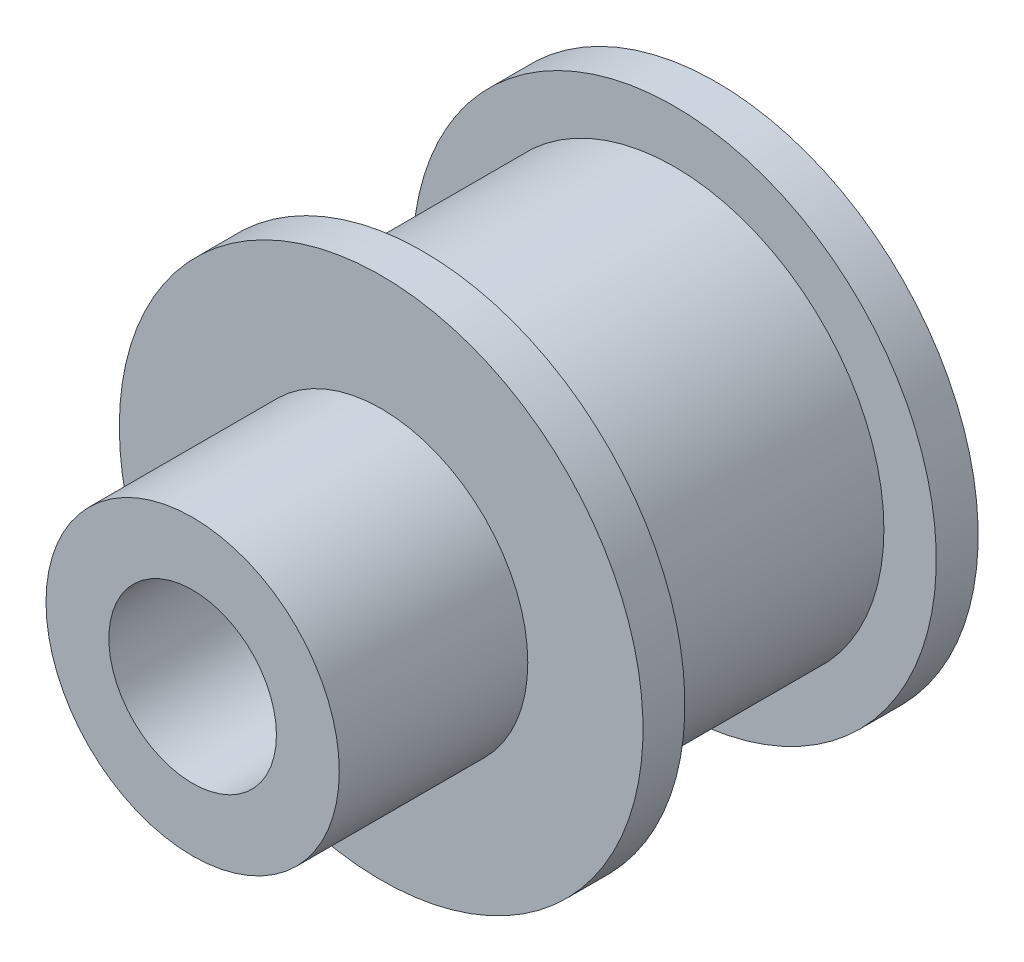
ISO-10303-21;
HEADER;
FILE_DESCRIPTION(('STEP AP214'),'2;1');
FILE_NAME('part.step','',(''),(''),'','','');
FILE_SCHEMA(('AUTOMOTIVE_DESIGN { 1 0 10303 214 1 1 1 1 }'));
ENDSEC;
DATA;
#1=APPLICATION_CONTEXT('core data for automotive mechanical design processes');
#2=APPLICATION_PROTOCOL_DEFINITION('international standard','automotive_design',2000,#1);
#3=PRODUCT_CONTEXT('',#1,'mechanical');
#4=PRODUCT('Part','Part','',(#3));
#5=PRODUCT_RELATED_PRODUCT_CATEGORY('part','',(#4));
#6=PRODUCT_DEFINITION_FORMATION('','',#4);
#7=PRODUCT_DEFINITION_CONTEXT('part definition',#1,'design');
#8=PRODUCT_DEFINITION('design','',#6,#7);
#9=PRODUCT_DEFINITION_SHAPE('','',#8);
#10=(LENGTH_UNIT() NAMED_UNIT(*) SI_UNIT(.MILLI.,.METRE.));
#11=(NAMED_UNIT(*) PLANE_ANGLE_UNIT() SI_UNIT($,.RADIAN.));
#12=(NAMED_UNIT(*) SI_UNIT($,.STERADIAN.) SOLID_ANGLE_UNIT());
#13=UNCERTAINTY_MEASURE_WITH_UNIT(LENGTH_MEASURE(1.E-05),#10,'distance_accuracy_value','');
#14=(GEOMETRIC_REPRESENTATION_CONTEXT(3) GLOBAL_UNCERTAINTY_ASSIGNED_CONTEXT((#13)) GLOBAL_UNIT_ASSIGNED_CONTEXT((#10,
#11,#12)) REPRESENTATION_CONTEXT('',''));
#15=CARTESIAN_POINT('',(0.,0.,0.));
#16=DIRECTION('',(0.,0.,1.));
#17=DIRECTION('',(1.,0.,0.));
#18=AXIS2_PLACEMENT_3D('',#15,#16,#17);
#19=CARTESIAN_POINT('',(0.,0.,-2.));
#20=DIRECTION('',(0.,0.,-1.));
#21=DIRECTION('',(-1.,0.,0.));
#22=AXIS2_PLACEMENT_3D('',#19,#20,#21);
#23=PLANE('',#22);
#24=CARTESIAN_POINT('',(0.,0.,-2.));
#25=DIRECTION('',(0.,0.,-1.));
#26=DIRECTION('',(-1.,0.,0.));
#27=AXIS2_PLACEMENT_3D('',#24,#25,#26);
#28=CIRCLE('',#27,12.5);
#29=CARTESIAN_POINT('',(-12.5,0.,-2.));
#30=VERTEX_POINT('',#29);
#31=EDGE_CURVE('E43',#30,#30,#28,.T.);
#32=ORIENTED_EDGE('',*,*,#31,.T.);
#33=EDGE_LOOP('',(#32));
#34=FACE_BOUND('',#33,.T.);
#35=CARTESIAN_POINT('',(0.,0.,-2.));
#36=DIRECTION('',(0.,0.,-1.));
#37=DIRECTION('',(-1.,0.,0.));
#38=AXIS2_PLACEMENT_3D('',#35,#36,#37);
#39=CIRCLE('',#38,10.);
#40=CARTESIAN_POINT('',(-10.,0.,-2.));
#41=VERTEX_POINT('',#40);
#42=EDGE_CURVE('E54',#41,#41,#39,.T.);
#43=ORIENTED_EDGE('',*,*,#42,.F.);
#44=EDGE_LOOP('',(#43));
#45=FACE_BOUND('',#44,.T.);
#46=ADVANCED_FACE('F28',(#34,#45),#23,.T.);
#47=CARTESIAN_POINT('',(0.,0.,9.));
#48=DIRECTION('',(0.,0.,1.));
#49=DIRECTION('',(1.,0.,0.));
#50=AXIS2_PLACEMENT_3D('',#47,#48,#49);
#51=PLANE('',#50);
#52=CARTESIAN_POINT('',(0.,0.,9.));
#53=DIRECTION('',(0.,0.,1.));
#54=DIRECTION('',(1.,0.,0.));
#55=AXIS2_PLACEMENT_3D('',#52,#53,#54);
#56=CIRCLE('',#55,7.);
#57=CARTESIAN_POINT('',(7.,0.,9.));
#58=VERTEX_POINT('',#57);
#59=EDGE_CURVE('E10',#58,#58,#56,.T.);
#60=ORIENTED_EDGE('',*,*,#59,.T.);
#61=EDGE_LOOP('',(#60));
#62=FACE_BOUND('',#61,.T.);
#63=CARTESIAN_POINT('',(0.,0.,9.));
#64=DIRECTION('',(0.,0.,1.));
#65=DIRECTION('',(1.,0.,0.));
#66=AXIS2_PLACEMENT_3D('',#63,#64,#65);
#67=CIRCLE('',#66,4.);
#68=CARTESIAN_POINT('',(4.,0.,9.));
#69=VERTEX_POINT('',#68);
#70=EDGE_CURVE('E35',#69,#69,#67,.T.);
#71=ORIENTED_EDGE('',*,*,#70,.F.);
#72=EDGE_LOOP('',(#71));
#73=FACE_BOUND('',#72,.T.);
#74=ADVANCED_FACE('F81',(#62,#73),#51,.T.);
#75=CARTESIAN_POINT('',(0.,0.,9.));
#76=DIRECTION('',(0.,0.,-1.));
#77=DIRECTION('',(-1.,0.,0.));
#78=AXIS2_PLACEMENT_3D('',#75,#76,#77);
#79=CYLINDRICAL_SURFACE('',#78,7.);
#80=ORIENTED_EDGE('',*,*,#59,.F.);
#81=EDGE_LOOP('',(#80));
#82=FACE_BOUND('',#81,.T.);
#83=CARTESIAN_POINT('',(0.,0.,0.));
#84=DIRECTION('',(0.,0.,-1.));
#85=DIRECTION('',(-1.,0.,0.));
#86=AXIS2_PLACEMENT_3D('',#83,#84,#85);
#87=CIRCLE('',#86,7.);
#88=CARTESIAN_POINT('',(-7.,0.,0.));
#89=VERTEX_POINT('',#88);
#90=EDGE_CURVE('E39',#89,#89,#87,.T.);
#91=ORIENTED_EDGE('',*,*,#90,.F.);
#92=EDGE_LOOP('',(#91));
#93=FACE_BOUND('',#92,.T.);
#94=ADVANCED_FACE('F30',(#82,#93),#79,.T.);
#95=CARTESIAN_POINT('',(0.,0.,9.));
#96=DIRECTION('',(0.,0.,-1.));
#97=DIRECTION('',(-1.,0.,0.));
#98=AXIS2_PLACEMENT_3D('',#95,#96,#97);
#99=CYLINDRICAL_SURFACE('',#98,4.);
#100=ORIENTED_EDGE('',*,*,#70,.T.);
#101=EDGE_LOOP('',(#100));
#102=FACE_BOUND('',#101,.T.);
#103=CARTESIAN_POINT('',(0.,0.,-16.));
#104=DIRECTION('',(0.,0.,1.));
#105=DIRECTION('',(1.,0.,0.));
#106=AXIS2_PLACEMENT_3D('',#103,#104,#105);
#107=CIRCLE('',#106,4.);
#108=CARTESIAN_POINT('',(4.,0.,-16.));
#109=VERTEX_POINT('',#108);
#110=EDGE_CURVE('E63',#109,#109,#107,.T.);
#111=ORIENTED_EDGE('',*,*,#110,.F.);
#112=EDGE_LOOP('',(#111));
#113=FACE_BOUND('',#112,.T.);
#114=ADVANCED_FACE('F70',(#102,#113),#99,.F.);
#115=CARTESIAN_POINT('',(0.,0.,0.));
#116=DIRECTION('',(0.,0.,-1.));
#117=DIRECTION('',(-1.,0.,0.));
#118=AXIS2_PLACEMENT_3D('',#115,#116,#117);
#119=PLANE('',#118);
#120=CARTESIAN_POINT('',(0.,0.,0.));
#121=DIRECTION('',(0.,0.,-1.));
#122=DIRECTION('',(-1.,0.,0.));
#123=AXIS2_PLACEMENT_3D('',#120,#121,#122);
#124=CIRCLE('',#123,12.5);
#125=CARTESIAN_POINT('',(-12.5,0.,0.));
#126=VERTEX_POINT('',#125);
#127=EDGE_CURVE('E48',#126,#126,#124,.T.);
#128=ORIENTED_EDGE('',*,*,#127,.F.);
#129=EDGE_LOOP('',(#128));
#130=FACE_BOUND('',#129,.T.);
#131=ORIENTED_EDGE('',*,*,#90,.T.);
#132=EDGE_LOOP('',(#131));
#133=FACE_BOUND('',#132,.T.);
#134=ADVANCED_FACE('F72',(#130,#133),#119,.F.);
#135=CARTESIAN_POINT('',(0.,0.,-2.));
#136=DIRECTION('',(0.,0.,1.));
#137=DIRECTION('',(1.,0.,0.));
#138=AXIS2_PLACEMENT_3D('',#135,#136,#137);
#139=CYLINDRICAL_SURFACE('',#138,12.5);
#140=ORIENTED_EDGE('',*,*,#31,.F.);
#141=EDGE_LOOP('',(#140));
#142=FACE_BOUND('',#141,.T.);
#143=ORIENTED_EDGE('',*,*,#127,.T.);
#144=EDGE_LOOP('',(#143));
#145=FACE_BOUND('',#144,.T.);
#146=ADVANCED_FACE('F78',(#142,#145),#139,.T.);
#147=CARTESIAN_POINT('',(0.,0.,-14.));
#148=DIRECTION('',(0.,0.,1.));
#149=DIRECTION('',(1.,0.,0.));
#150=AXIS2_PLACEMENT_3D('',#147,#148,#149);
#151=CYLINDRICAL_SURFACE('',#150,10.);
#152=CARTESIAN_POINT('',(0.,0.,-14.));
#153=DIRECTION('',(0.,0.,-1.));
#154=DIRECTION('',(-1.,0.,0.));
#155=AXIS2_PLACEMENT_3D('',#152,#153,#154);
#156=CIRCLE('',#155,10.);
#157=CARTESIAN_POINT('',(-10.,0.,-14.));
#158=VERTEX_POINT('',#157);
#159=EDGE_CURVE('E51',#158,#158,#156,.T.);
#160=ORIENTED_EDGE('',*,*,#159,.F.);
#161=EDGE_LOOP('',(#160));
#162=FACE_BOUND('',#161,.T.);
#163=ORIENTED_EDGE('',*,*,#42,.T.);
#164=EDGE_LOOP('',(#163));
#165=FACE_BOUND('',#164,.T.);
#166=ADVANCED_FACE('F93',(#162,#165),#151,.T.);
#167=CARTESIAN_POINT('',(0.,0.,-14.));
#168=DIRECTION('',(0.,0.,-1.));
#169=DIRECTION('',(-1.,0.,0.));
#170=AXIS2_PLACEMENT_3D('',#167,#168,#169);
#171=PLANE('',#170);
#172=CARTESIAN_POINT('',(0.,0.,-14.));
#173=DIRECTION('',(0.,0.,-1.));
#174=DIRECTION('',(-1.,0.,0.));
#175=AXIS2_PLACEMENT_3D('',#172,#173,#174);
#176=CIRCLE('',#175,12.5);
#177=CARTESIAN_POINT('',(-12.5,0.,-14.));
#178=VERTEX_POINT('',#177);
#179=EDGE_CURVE('E60',#178,#178,#176,.T.);
#180=ORIENTED_EDGE('',*,*,#179,.F.);
#181=EDGE_LOOP('',(#180));
#182=FACE_BOUND('',#181,.T.);
#183=ORIENTED_EDGE('',*,*,#159,.T.);
#184=EDGE_LOOP('',(#183));
#185=FACE_BOUND('',#184,.T.);
#186=ADVANCED_FACE('F98',(#182,#185),#171,.F.);
#187=CARTESIAN_POINT('',(0.,0.,-16.));
#188=DIRECTION('',(0.,0.,1.));
#189=DIRECTION('',(1.,0.,0.));
#190=AXIS2_PLACEMENT_3D('',#187,#188,#189);
#191=CYLINDRICAL_SURFACE('',#190,12.5);
#192=CARTESIAN_POINT('',(0.,0.,-16.));
#193=DIRECTION('',(0.,0.,-1.));
#194=DIRECTION('',(-1.,0.,0.));
#195=AXIS2_PLACEMENT_3D('',#192,#193,#194);
#196=CIRCLE('',#195,12.5);
#197=CARTESIAN_POINT('',(-12.5,0.,-16.));
#198=VERTEX_POINT('',#197);
#199=EDGE_CURVE('E57',#198,#198,#196,.T.);
#200=ORIENTED_EDGE('',*,*,#199,.F.);
#201=EDGE_LOOP('',(#200));
#202=FACE_BOUND('',#201,.T.);
#203=ORIENTED_EDGE('',*,*,#179,.T.);
#204=EDGE_LOOP('',(#203));
#205=FACE_BOUND('',#204,.T.);
#206=ADVANCED_FACE('F109',(#202,#205),#191,.T.);
#207=CARTESIAN_POINT('',(0.,0.,-16.));
#208=DIRECTION('',(0.,0.,-1.));
#209=DIRECTION('',(-1.,0.,0.));
#210=AXIS2_PLACEMENT_3D('',#207,#208,#209);
#211=PLANE('',#210);
#212=ORIENTED_EDGE('',*,*,#110,.T.);
#213=EDGE_LOOP('',(#212));
#214=FACE_BOUND('',#213,.T.);
#215=ORIENTED_EDGE('',*,*,#199,.T.);
#216=EDGE_LOOP('',(#215));
#217=FACE_BOUND('',#216,.T.);
#218=ADVANCED_FACE('F67',(#214,#217),#211,.T.);
#219=CLOSED_SHELL('',(#46,#74,#94,#114,#134,#146,#166,#186,#206,#218));
#220=MANIFOLD_SOLID_BREP('B2',#219);
#221=ADVANCED_BREP_SHAPE_REPRESENTATION('',(#18,#220),#14);
#222=SHAPE_DEFINITION_REPRESENTATION(#9,#221);
ENDSEC;
END-ISO-10303-21;
